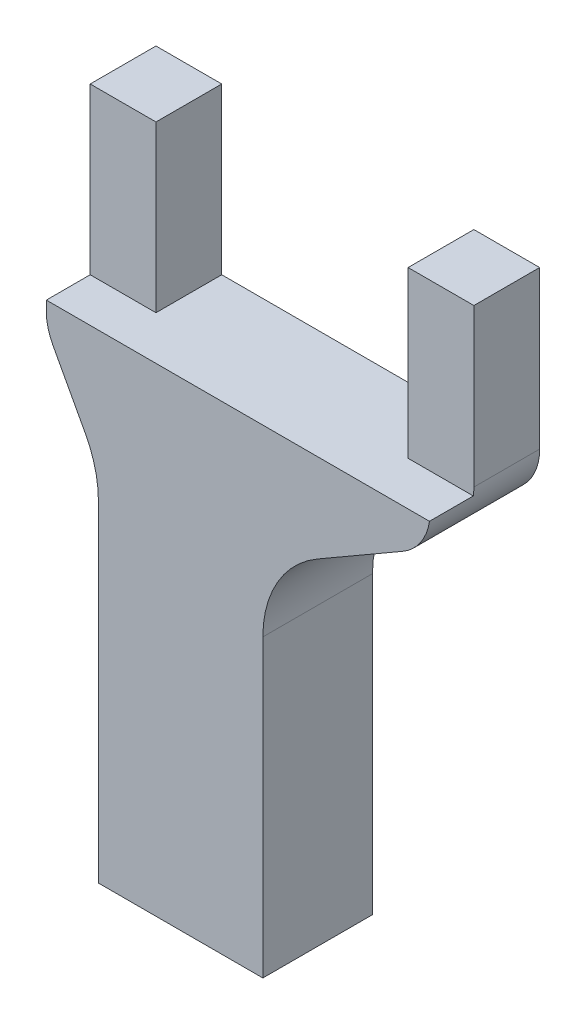
ISO-10303-21;
HEADER;
FILE_DESCRIPTION(('STEP AP214'),'2;1');
FILE_NAME('part.step','',(''),(''),'','','');
FILE_SCHEMA(('AUTOMOTIVE_DESIGN { 1 0 10303 214 1 1 1 1 }'));
ENDSEC;
DATA;
#1=APPLICATION_CONTEXT('core data for automotive mechanical design processes');
#2=APPLICATION_PROTOCOL_DEFINITION('international standard','automotive_design',2000,#1);
#3=PRODUCT_CONTEXT('',#1,'mechanical');
#4=PRODUCT('Part','Part','',(#3));
#5=PRODUCT_RELATED_PRODUCT_CATEGORY('part','',(#4));
#6=PRODUCT_DEFINITION_FORMATION('','',#4);
#7=PRODUCT_DEFINITION_CONTEXT('part definition',#1,'design');
#8=PRODUCT_DEFINITION('design','',#6,#7);
#9=PRODUCT_DEFINITION_SHAPE('','',#8);
#10=(LENGTH_UNIT() NAMED_UNIT(*) SI_UNIT(.MILLI.,.METRE.));
#11=(NAMED_UNIT(*) PLANE_ANGLE_UNIT() SI_UNIT($,.RADIAN.));
#12=(NAMED_UNIT(*) SI_UNIT($,.STERADIAN.) SOLID_ANGLE_UNIT());
#13=UNCERTAINTY_MEASURE_WITH_UNIT(LENGTH_MEASURE(1.E-05),#10,'distance_accuracy_value','');
#14=(GEOMETRIC_REPRESENTATION_CONTEXT(3) GLOBAL_UNCERTAINTY_ASSIGNED_CONTEXT((#13)) GLOBAL_UNIT_ASSIGNED_CONTEXT((#10,
#11,#12)) REPRESENTATION_CONTEXT('',''));
#15=CARTESIAN_POINT('',(0.,0.,0.));
#16=DIRECTION('',(0.,0.,1.));
#17=DIRECTION('',(1.,0.,0.));
#18=AXIS2_PLACEMENT_3D('',#15,#16,#17);
#19=CARTESIAN_POINT('',(-6.24999999999976,526.071170630325,10.));
#20=DIRECTION('',(0.,-1.,0.));
#21=DIRECTION('',(0.,0.,-1.));
#22=AXIS2_PLACEMENT_3D('',#19,#20,#21);
#23=PLANE('',#22);
#24=DIRECTION('',(-1.,0.,0.));
#25=VECTOR('',#24,1.);
#26=CARTESIAN_POINT('',(-12.2499999999998,526.071170630325,6.));
#27=LINE('',#26,#25);
#28=CARTESIAN_POINT('',(-6.24999999999976,526.071170630325,6.));
#29=VERTEX_POINT('',#28);
#30=CARTESIAN_POINT('',(-12.2499999999998,526.071170630325,6.));
#31=VERTEX_POINT('',#30);
#32=EDGE_CURVE('E174',#29,#31,#27,.T.);
#33=ORIENTED_EDGE('',*,*,#32,.F.);
#34=DIRECTION('',(0.,0.,-1.));
#35=VECTOR('',#34,1.);
#36=CARTESIAN_POINT('',(-6.24999999999976,526.071170630325,10.));
#37=LINE('',#36,#35);
#38=CARTESIAN_POINT('',(-6.24999999999976,526.071170630325,0.));
#39=VERTEX_POINT('',#38);
#40=EDGE_CURVE('E206',#29,#39,#37,.T.);
#41=ORIENTED_EDGE('',*,*,#40,.T.);
#42=DIRECTION('',(-1.,0.,0.));
#43=VECTOR('',#42,1.);
#44=CARTESIAN_POINT('',(-6.24999999999976,526.071170630325,0.));
#45=LINE('',#44,#43);
#46=CARTESIAN_POINT('',(-12.2499999999998,526.071170630325,0.));
#47=VERTEX_POINT('',#46);
#48=EDGE_CURVE('E190',#39,#47,#45,.T.);
#49=ORIENTED_EDGE('',*,*,#48,.T.);
#50=DIRECTION('',(0.,0.,-1.));
#51=VECTOR('',#50,1.);
#52=CARTESIAN_POINT('',(-12.2499999999998,526.071170630325,10.));
#53=LINE('',#52,#51);
#54=EDGE_CURVE('E251',#31,#47,#53,.T.);
#55=ORIENTED_EDGE('',*,*,#54,.F.);
#56=EDGE_LOOP('',(#33,#41,#49,#55));
#57=FACE_BOUND('',#56,.T.);
#58=ADVANCED_FACE('F35',(#57),#23,.F.);
#59=CARTESIAN_POINT('',(22.7500000000002,526.071170630325,10.));
#60=DIRECTION('',(-1.,0.,0.));
#61=DIRECTION('',(0.,-1.,0.));
#62=AXIS2_PLACEMENT_3D('',#59,#60,#61);
#63=PLANE('',#62);
#64=DIRECTION('',(0.,1.,0.));
#65=VECTOR('',#64,1.);
#66=CARTESIAN_POINT('',(22.7500000000002,526.071170630325,6.));
#67=LINE('',#66,#65);
#68=CARTESIAN_POINT('',(22.7500000000003,511.729317394923,6.));
#69=VERTEX_POINT('',#68);
#70=CARTESIAN_POINT('',(22.7500000000002,526.071170630325,6.));
#71=VERTEX_POINT('',#70);
#72=EDGE_CURVE('E168',#69,#71,#67,.T.);
#73=ORIENTED_EDGE('',*,*,#72,.F.);
#74=DIRECTION('',(0.,0.,-1.));
#75=VECTOR('',#74,1.);
#76=CARTESIAN_POINT('',(22.7500000000003,511.729317394923,10.));
#77=LINE('',#76,#75);
#78=CARTESIAN_POINT('',(22.7500000000003,511.729317394923,0.));
#79=VERTEX_POINT('',#78);
#80=EDGE_CURVE('E286',#69,#79,#77,.T.);
#81=ORIENTED_EDGE('',*,*,#80,.T.);
#82=DIRECTION('',(0.,1.,0.));
#83=VECTOR('',#82,1.);
#84=CARTESIAN_POINT('',(22.7500000000002,526.071170630325,0.));
#85=LINE('',#84,#83);
#86=CARTESIAN_POINT('',(22.7500000000002,526.071170630325,0.));
#87=VERTEX_POINT('',#86);
#88=EDGE_CURVE('E224',#79,#87,#85,.T.);
#89=ORIENTED_EDGE('',*,*,#88,.T.);
#90=DIRECTION('',(0.,0.,-1.));
#91=VECTOR('',#90,1.);
#92=CARTESIAN_POINT('',(22.7500000000002,526.071170630325,10.));
#93=LINE('',#92,#91);
#94=EDGE_CURVE('E243',#71,#87,#93,.T.);
#95=ORIENTED_EDGE('',*,*,#94,.F.);
#96=EDGE_LOOP('',(#73,#81,#89,#95));
#97=FACE_BOUND('',#96,.T.);
#98=ADVANCED_FACE('F300',(#97),#63,.F.);
#99=CARTESIAN_POINT('',(16.7500000000002,526.071170630325,10.));
#100=DIRECTION('',(0.,-1.,0.));
#101=DIRECTION('',(0.,0.,-1.));
#102=AXIS2_PLACEMENT_3D('',#99,#100,#101);
#103=PLANE('',#102);
#104=CARTESIAN_POINT('',(16.7500000000003,526.071170630325,6.));
#105=VERTEX_POINT('',#104);
#106=EDGE_CURVE('E182',#71,#105,#27,.T.);
#107=ORIENTED_EDGE('',*,*,#106,.F.);
#108=ORIENTED_EDGE('',*,*,#94,.T.);
#109=DIRECTION('',(-1.,0.,0.));
#110=VECTOR('',#109,1.);
#111=CARTESIAN_POINT('',(16.7500000000002,526.071170630325,0.));
#112=LINE('',#111,#110);
#113=CARTESIAN_POINT('',(16.7500000000002,526.071170630325,0.));
#114=VERTEX_POINT('',#113);
#115=EDGE_CURVE('E227',#87,#114,#112,.T.);
#116=ORIENTED_EDGE('',*,*,#115,.T.);
#117=DIRECTION('',(0.,0.,-1.));
#118=VECTOR('',#117,1.);
#119=CARTESIAN_POINT('',(16.7500000000002,526.071170630325,10.));
#120=LINE('',#119,#118);
#121=EDGE_CURVE('E241',#105,#114,#120,.T.);
#122=ORIENTED_EDGE('',*,*,#121,.F.);
#123=EDGE_LOOP('',(#107,#108,#116,#122));
#124=FACE_BOUND('',#123,.T.);
#125=ADVANCED_FACE('F304',(#124),#103,.F.);
#126=CARTESIAN_POINT('',(16.7500000000002,526.071170630325,10.));
#127=DIRECTION('',(1.,0.,0.));
#128=DIRECTION('',(0.,1.,0.));
#129=AXIS2_PLACEMENT_3D('',#126,#127,#128);
#130=PLANE('',#129);
#131=DIRECTION('',(0.,-1.,0.));
#132=VECTOR('',#131,1.);
#133=CARTESIAN_POINT('',(16.7500000000002,526.071170630325,6.));
#134=LINE('',#133,#132);
#135=CARTESIAN_POINT('',(16.7500000000003,511.000207075114,6.));
#136=VERTEX_POINT('',#135);
#137=EDGE_CURVE('E184',#105,#136,#134,.T.);
#138=ORIENTED_EDGE('',*,*,#137,.F.);
#139=ORIENTED_EDGE('',*,*,#121,.T.);
#140=DIRECTION('',(0.,-1.,0.));
#141=VECTOR('',#140,1.);
#142=CARTESIAN_POINT('',(16.7500000000002,526.071170630325,0.));
#143=LINE('',#142,#141);
#144=CARTESIAN_POINT('',(16.7500000000003,511.000207075114,0.));
#145=VERTEX_POINT('',#144);
#146=EDGE_CURVE('E230',#114,#145,#143,.T.);
#147=ORIENTED_EDGE('',*,*,#146,.T.);
#148=DIRECTION('',(0.,0.,-1.));
#149=VECTOR('',#148,1.);
#150=CARTESIAN_POINT('',(16.7500000000003,511.000207075114,10.));
#151=LINE('',#150,#149);
#152=EDGE_CURVE('E239',#136,#145,#151,.T.);
#153=ORIENTED_EDGE('',*,*,#152,.F.);
#154=EDGE_LOOP('',(#138,#139,#147,#153));
#155=FACE_BOUND('',#154,.T.);
#156=ADVANCED_FACE('F310',(#155),#130,.F.);
#157=CARTESIAN_POINT('',(-6.24999999999976,526.071170630325,10.));
#158=DIRECTION('',(-1.,0.,0.));
#159=DIRECTION('',(0.,-1.,0.));
#160=AXIS2_PLACEMENT_3D('',#157,#158,#159);
#161=PLANE('',#160);
#162=DIRECTION('',(0.,1.,0.));
#163=VECTOR('',#162,1.);
#164=CARTESIAN_POINT('',(-6.24999999999976,526.071170630325,6.));
#165=LINE('',#164,#163);
#166=CARTESIAN_POINT('',(-6.24999999999976,511.000207075114,6.));
#167=VERTEX_POINT('',#166);
#168=EDGE_CURVE('E181',#167,#29,#165,.T.);
#169=ORIENTED_EDGE('',*,*,#168,.F.);
#170=DIRECTION('',(0.,0.,-1.));
#171=VECTOR('',#170,1.);
#172=CARTESIAN_POINT('',(-6.24999999999976,511.000207075114,10.));
#173=LINE('',#172,#171);
#174=CARTESIAN_POINT('',(-6.24999999999976,511.000207075114,0.));
#175=VERTEX_POINT('',#174);
#176=EDGE_CURVE('E165',#167,#175,#173,.T.);
#177=ORIENTED_EDGE('',*,*,#176,.T.);
#178=DIRECTION('',(0.,1.,0.));
#179=VECTOR('',#178,1.);
#180=CARTESIAN_POINT('',(-6.24999999999976,526.071170630325,0.));
#181=LINE('',#180,#179);
#182=EDGE_CURVE('E193',#175,#39,#181,.T.);
#183=ORIENTED_EDGE('',*,*,#182,.T.);
#184=ORIENTED_EDGE('',*,*,#40,.F.);
#185=EDGE_LOOP('',(#169,#177,#183,#184));
#186=FACE_BOUND('',#185,.T.);
#187=ADVANCED_FACE('F320',(#186),#161,.F.);
#188=CARTESIAN_POINT('',(-12.2499999999998,526.071170630325,10.));
#189=DIRECTION('',(1.,0.,0.));
#190=DIRECTION('',(0.,1.,0.));
#191=AXIS2_PLACEMENT_3D('',#188,#189,#190);
#192=PLANE('',#191);
#193=DIRECTION('',(0.,-1.,0.));
#194=VECTOR('',#193,1.);
#195=CARTESIAN_POINT('',(-12.2499999999998,526.071170630325,10.));
#196=LINE('',#195,#194);
#197=CARTESIAN_POINT('',(-12.2499999999998,511.000207075114,10.));
#198=VERTEX_POINT('',#197);
#199=CARTESIAN_POINT('',(-12.2499999999998,510.105275726691,10.));
#200=VERTEX_POINT('',#199);
#201=EDGE_CURVE('E180',#198,#200,#196,.T.);
#202=ORIENTED_EDGE('',*,*,#201,.F.);
#203=DIRECTION('',(0.,0.,1.));
#204=VECTOR('',#203,1.);
#205=CARTESIAN_POINT('',(-12.2499999999998,511.000207075114,6.));
#206=LINE('',#205,#204);
#207=CARTESIAN_POINT('',(-12.2499999999998,511.000207075114,6.));
#208=VERTEX_POINT('',#207);
#209=EDGE_CURVE('E162',#208,#198,#206,.T.);
#210=ORIENTED_EDGE('',*,*,#209,.F.);
#211=DIRECTION('',(0.,-1.,0.));
#212=VECTOR('',#211,1.);
#213=CARTESIAN_POINT('',(-12.2499999999998,526.071170630325,6.));
#214=LINE('',#213,#212);
#215=EDGE_CURVE('E171',#31,#208,#214,.T.);
#216=ORIENTED_EDGE('',*,*,#215,.F.);
#217=ORIENTED_EDGE('',*,*,#54,.T.);
#218=DIRECTION('',(0.,-1.,0.));
#219=VECTOR('',#218,1.);
#220=CARTESIAN_POINT('',(-12.2499999999998,526.071170630325,0.));
#221=LINE('',#220,#219);
#222=CARTESIAN_POINT('',(-12.2499999999998,510.105275726691,0.));
#223=VERTEX_POINT('',#222);
#224=EDGE_CURVE('E209',#47,#223,#221,.T.);
#225=ORIENTED_EDGE('',*,*,#224,.T.);
#226=DIRECTION('',(0.,0.,-1.));
#227=VECTOR('',#226,1.);
#228=CARTESIAN_POINT('',(-12.2499999999998,510.105275726691,10.));
#229=LINE('',#228,#227);
#230=EDGE_CURVE('E280',#223,#200,#229,.F.);
#231=ORIENTED_EDGE('',*,*,#230,.T.);
#232=EDGE_LOOP('',(#202,#210,#216,#217,#225,#231));
#233=FACE_BOUND('',#232,.T.);
#234=ADVANCED_FACE('F178',(#233),#192,.F.);
#235=CARTESIAN_POINT('',(-12.2499999999998,508.842566048975,10.));
#236=DIRECTION('',(0.880092531657774,0.474802206945388,0.));
#237=DIRECTION('',(-0.474802206945388,0.880092531657774,0.));
#238=AXIS2_PLACEMENT_3D('',#235,#236,#237);
#239=PLANE('',#238);
#240=DIRECTION('',(0.474802206945388,-0.880092531657774,0.));
#241=VECTOR('',#240,1.);
#242=CARTESIAN_POINT('',(-12.2499999999998,508.842566048975,10.));
#243=LINE('',#242,#241);
#244=CARTESIAN_POINT('',(-11.6504626582886,507.731264691964,10.));
#245=VERTEX_POINT('',#244);
#246=CARTESIAN_POINT('',(-8.69907468342228,502.260577157854,10.));
#247=VERTEX_POINT('',#246);
#248=EDGE_CURVE('E192',#245,#247,#243,.T.);
#249=ORIENTED_EDGE('',*,*,#248,.F.);
#250=DIRECTION('',(0.,0.,-1.));
#251=VECTOR('',#250,1.);
#252=CARTESIAN_POINT('',(-11.6504626582886,507.731264691964,10.));
#253=LINE('',#252,#251);
#254=CARTESIAN_POINT('',(-11.6504626582886,507.731264691964,0.));
#255=VERTEX_POINT('',#254);
#256=EDGE_CURVE('E273',#245,#255,#253,.T.);
#257=ORIENTED_EDGE('',*,*,#256,.T.);
#258=DIRECTION('',(0.474802206945388,-0.880092531657774,0.));
#259=VECTOR('',#258,1.);
#260=CARTESIAN_POINT('',(-12.2499999999998,508.842566048975,0.));
#261=LINE('',#260,#259);
#262=CARTESIAN_POINT('',(-8.69907468342228,502.260577157854,0.));
#263=VERTEX_POINT('',#262);
#264=EDGE_CURVE('E212',#255,#263,#261,.T.);
#265=ORIENTED_EDGE('',*,*,#264,.T.);
#266=DIRECTION('',(0.,0.,-1.));
#267=VECTOR('',#266,1.);
#268=CARTESIAN_POINT('',(-8.69907468342227,502.260577157854,10.));
#269=LINE('',#268,#267);
#270=EDGE_CURVE('E256',#263,#247,#269,.F.);
#271=ORIENTED_EDGE('',*,*,#270,.T.);
#272=EDGE_LOOP('',(#249,#257,#265,#271));
#273=FACE_BOUND('',#272,.T.);
#274=ADVANCED_FACE('F329',(#273),#239,.F.);
#275=CARTESIAN_POINT('',(-7.5,467.320715150803,10.));
#276=DIRECTION('',(1.,0.,0.));
#277=DIRECTION('',(0.,0.,-1.));
#278=AXIS2_PLACEMENT_3D('',#275,#276,#277);
#279=PLANE('',#278);
#280=DIRECTION('',(0.,-1.,0.));
#281=VECTOR('',#280,1.);
#282=CARTESIAN_POINT('',(-7.5,467.320715150803,10.));
#283=LINE('',#282,#281);
#284=CARTESIAN_POINT('',(-7.5,497.5125550884,10.));
#285=VERTEX_POINT('',#284);
#286=CARTESIAN_POINT('',(-7.5,467.320715150803,10.));
#287=VERTEX_POINT('',#286);
#288=EDGE_CURVE('E195',#285,#287,#283,.T.);
#289=ORIENTED_EDGE('',*,*,#288,.F.);
#290=DIRECTION('',(0.,0.,-1.));
#291=VECTOR('',#290,1.);
#292=CARTESIAN_POINT('',(-7.5,497.5125550884,0.));
#293=LINE('',#292,#291);
#294=CARTESIAN_POINT('',(-7.5,497.5125550884,0.));
#295=VERTEX_POINT('',#294);
#296=EDGE_CURVE('E253',#285,#295,#293,.T.);
#297=ORIENTED_EDGE('',*,*,#296,.T.);
#298=DIRECTION('',(0.,-1.,0.));
#299=VECTOR('',#298,1.);
#300=CARTESIAN_POINT('',(-7.5,467.320715150803,0.));
#301=LINE('',#300,#299);
#302=CARTESIAN_POINT('',(-7.5,467.320715150803,0.));
#303=VERTEX_POINT('',#302);
#304=EDGE_CURVE('E214',#295,#303,#301,.T.);
#305=ORIENTED_EDGE('',*,*,#304,.T.);
#306=DIRECTION('',(0.,0.,-1.));
#307=VECTOR('',#306,1.);
#308=CARTESIAN_POINT('',(-7.5,467.320715150803,10.));
#309=LINE('',#308,#307);
#310=EDGE_CURVE('E248',#287,#303,#309,.T.);
#311=ORIENTED_EDGE('',*,*,#310,.F.);
#312=EDGE_LOOP('',(#289,#297,#305,#311));
#313=FACE_BOUND('',#312,.T.);
#314=ADVANCED_FACE('F338',(#313),#279,.F.);
#315=CARTESIAN_POINT('',(7.5,467.320715150803,10.));
#316=DIRECTION('',(0.,1.,0.));
#317=DIRECTION('',(0.,0.,1.));
#318=AXIS2_PLACEMENT_3D('',#315,#316,#317);
#319=PLANE('',#318);
#320=DIRECTION('',(1.,0.,0.));
#321=VECTOR('',#320,1.);
#322=CARTESIAN_POINT('',(7.5,467.320715150803,0.));
#323=LINE('',#322,#321);
#324=CARTESIAN_POINT('',(7.5,467.320715150803,0.));
#325=VERTEX_POINT('',#324);
#326=EDGE_CURVE('E216',#303,#325,#323,.T.);
#327=ORIENTED_EDGE('',*,*,#326,.T.);
#328=DIRECTION('',(0.,0.,-1.));
#329=VECTOR('',#328,1.);
#330=CARTESIAN_POINT('',(7.5,467.320715150803,10.));
#331=LINE('',#330,#329);
#332=CARTESIAN_POINT('',(7.5,467.320715150803,10.));
#333=VERTEX_POINT('',#332);
#334=EDGE_CURVE('E245',#333,#325,#331,.T.);
#335=ORIENTED_EDGE('',*,*,#334,.F.);
#336=DIRECTION('',(1.,0.,0.));
#337=VECTOR('',#336,1.);
#338=CARTESIAN_POINT('',(7.5,467.320715150803,10.));
#339=LINE('',#338,#337);
#340=EDGE_CURVE('E197',#287,#333,#339,.T.);
#341=ORIENTED_EDGE('',*,*,#340,.F.);
#342=ORIENTED_EDGE('',*,*,#310,.T.);
#343=EDGE_LOOP('',(#327,#335,#341,#342));
#344=FACE_BOUND('',#343,.T.);
#345=ADVANCED_FACE('F345',(#344),#319,.F.);
#346=CARTESIAN_POINT('',(7.5,467.320715150803,10.));
#347=DIRECTION('',(-1.,0.,0.));
#348=DIRECTION('',(0.,0.,1.));
#349=AXIS2_PLACEMENT_3D('',#346,#347,#348);
#350=PLANE('',#349);
#351=DIRECTION('',(0.,1.,0.));
#352=VECTOR('',#351,1.);
#353=CARTESIAN_POINT('',(7.5,467.320715150803,0.));
#354=LINE('',#353,#352);
#355=CARTESIAN_POINT('',(7.5,494.264471751936,0.));
#356=VERTEX_POINT('',#355);
#357=EDGE_CURVE('E218',#325,#356,#354,.T.);
#358=ORIENTED_EDGE('',*,*,#357,.T.);
#359=DIRECTION('',(0.,0.,-1.));
#360=VECTOR('',#359,1.);
#361=CARTESIAN_POINT('',(7.5,494.264471751936,10.));
#362=LINE('',#361,#360);
#363=CARTESIAN_POINT('',(7.5,494.264471751936,10.));
#364=VERTEX_POINT('',#363);
#365=EDGE_CURVE('E262',#356,#364,#362,.F.);
#366=ORIENTED_EDGE('',*,*,#365,.T.);
#367=DIRECTION('',(0.,1.,0.));
#368=VECTOR('',#367,1.);
#369=CARTESIAN_POINT('',(7.5,467.320715150803,10.));
#370=LINE('',#369,#368);
#371=EDGE_CURVE('E199',#333,#364,#370,.T.);
#372=ORIENTED_EDGE('',*,*,#371,.F.);
#373=ORIENTED_EDGE('',*,*,#334,.T.);
#374=EDGE_LOOP('',(#358,#366,#372,#373));
#375=FACE_BOUND('',#374,.T.);
#376=ADVANCED_FACE('F359',(#375),#350,.F.);
#377=CARTESIAN_POINT('',(22.7500000000003,508.842566048975,10.));
#378=DIRECTION('',(-0.499999999999999,0.866025403784439,0.));
#379=DIRECTION('',(-0.866025403784439,-0.499999999999999,0.));
#380=AXIS2_PLACEMENT_3D('',#377,#378,#379);
#381=PLANE('',#380);
#382=DIRECTION('',(0.866025403784439,0.499999999999999,0.));
#383=VECTOR('',#382,1.);
#384=CARTESIAN_POINT('',(22.7500000000003,508.842566048975,0.));
#385=LINE('',#384,#383);
#386=CARTESIAN_POINT('',(12.5,502.924725789781,0.));
#387=VERTEX_POINT('',#386);
#388=CARTESIAN_POINT('',(20.2500000000003,507.399190376001,0.));
#389=VERTEX_POINT('',#388);
#390=EDGE_CURVE('E221',#387,#389,#385,.T.);
#391=ORIENTED_EDGE('',*,*,#390,.T.);
#392=DIRECTION('',(0.,0.,-1.));
#393=VECTOR('',#392,1.);
#394=CARTESIAN_POINT('',(20.2500000000003,507.399190376001,10.));
#395=LINE('',#394,#393);
#396=CARTESIAN_POINT('',(20.2500000000003,507.399190376001,10.));
#397=VERTEX_POINT('',#396);
#398=EDGE_CURVE('E288',#389,#397,#395,.F.);
#399=ORIENTED_EDGE('',*,*,#398,.T.);
#400=DIRECTION('',(0.866025403784439,0.499999999999999,0.));
#401=VECTOR('',#400,1.);
#402=CARTESIAN_POINT('',(22.7500000000003,508.842566048975,10.));
#403=LINE('',#402,#401);
#404=CARTESIAN_POINT('',(12.5,502.924725789781,10.));
#405=VERTEX_POINT('',#404);
#406=EDGE_CURVE('E202',#405,#397,#403,.T.);
#407=ORIENTED_EDGE('',*,*,#406,.F.);
#408=DIRECTION('',(0.,0.,-1.));
#409=VECTOR('',#408,1.);
#410=CARTESIAN_POINT('',(12.5,502.924725789781,0.));
#411=LINE('',#410,#409);
#412=EDGE_CURVE('E259',#405,#387,#411,.T.);
#413=ORIENTED_EDGE('',*,*,#412,.T.);
#414=EDGE_LOOP('',(#391,#399,#407,#413));
#415=FACE_BOUND('',#414,.T.);
#416=ADVANCED_FACE('F357',(#415),#381,.F.);
#417=CARTESIAN_POINT('',(-6.24999999999976,511.000207075114,10.));
#418=DIRECTION('',(0.,-1.,0.));
#419=DIRECTION('',(0.,0.,-1.));
#420=AXIS2_PLACEMENT_3D('',#417,#418,#419);
#421=PLANE('',#420);
#422=DIRECTION('',(-1.,0.,0.));
#423=VECTOR('',#422,1.);
#424=CARTESIAN_POINT('',(-6.24999999999976,511.000207075114,10.));
#425=LINE('',#424,#423);
#426=CARTESIAN_POINT('',(22.6965541684642,511.000207075114,10.));
#427=VERTEX_POINT('',#426);
#428=EDGE_CURVE('E50',#427,#198,#425,.T.);
#429=ORIENTED_EDGE('',*,*,#428,.F.);
#430=DIRECTION('',(0.,0.,-1.));
#431=VECTOR('',#430,1.);
#432=CARTESIAN_POINT('',(22.6965541684642,511.000207075114,10.));
#433=LINE('',#432,#431);
#434=CARTESIAN_POINT('',(22.6965541684642,511.000207075114,6.));
#435=VERTEX_POINT('',#434);
#436=EDGE_CURVE('E11',#427,#435,#433,.T.);
#437=ORIENTED_EDGE('',*,*,#436,.T.);
#438=DIRECTION('',(1.,0.,0.));
#439=VECTOR('',#438,1.);
#440=CARTESIAN_POINT('',(-12.2499999999998,511.000207075114,6.));
#441=LINE('',#440,#439);
#442=EDGE_CURVE('E58',#136,#435,#441,.T.);
#443=ORIENTED_EDGE('',*,*,#442,.F.);
#444=ORIENTED_EDGE('',*,*,#152,.T.);
#445=DIRECTION('',(-1.,0.,0.));
#446=VECTOR('',#445,1.);
#447=CARTESIAN_POINT('',(-6.24999999999976,511.000207075114,0.));
#448=LINE('',#447,#446);
#449=EDGE_CURVE('E233',#145,#175,#448,.T.);
#450=ORIENTED_EDGE('',*,*,#449,.T.);
#451=ORIENTED_EDGE('',*,*,#176,.F.);
#452=EDGE_CURVE('E158',#208,#167,#441,.T.);
#453=ORIENTED_EDGE('',*,*,#452,.F.);
#454=ORIENTED_EDGE('',*,*,#209,.T.);
#455=EDGE_LOOP('',(#429,#437,#443,#444,#450,#451,#453,#454));
#456=FACE_BOUND('',#455,.T.);
#457=ADVANCED_FACE('F160',(#456),#421,.F.);
#458=CARTESIAN_POINT('',(0.,0.,10.));
#459=DIRECTION('',(0.,0.,1.));
#460=DIRECTION('',(1.,0.,0.));
#461=AXIS2_PLACEMENT_3D('',#458,#459,#460);
#462=PLANE('',#461);
#463=ORIENTED_EDGE('',*,*,#428,.T.);
#464=ORIENTED_EDGE('',*,*,#201,.T.);
#465=CARTESIAN_POINT('',(-7.24999999999976,510.105275726691,10.));
#466=DIRECTION('',(0.,0.,1.));
#467=DIRECTION('',(1.,0.,0.));
#468=AXIS2_PLACEMENT_3D('',#465,#466,#467);
#469=CIRCLE('',#468,5.);
#470=EDGE_CURVE('E284',#200,#245,#469,.T.);
#471=ORIENTED_EDGE('',*,*,#470,.T.);
#472=ORIENTED_EDGE('',*,*,#248,.T.);
#473=CARTESIAN_POINT('',(-17.5,497.5125550884,10.));
#474=DIRECTION('',(0.,0.,1.));
#475=DIRECTION('',(1.,0.,0.));
#476=AXIS2_PLACEMENT_3D('',#473,#474,#475);
#477=CIRCLE('',#476,10.);
#478=EDGE_CURVE('E267',#247,#285,#477,.F.);
#479=ORIENTED_EDGE('',*,*,#478,.T.);
#480=ORIENTED_EDGE('',*,*,#288,.T.);
#481=ORIENTED_EDGE('',*,*,#340,.T.);
#482=ORIENTED_EDGE('',*,*,#371,.T.);
#483=CARTESIAN_POINT('',(17.5,494.264471751936,10.));
#484=DIRECTION('',(0.,0.,1.));
#485=DIRECTION('',(1.,0.,0.));
#486=AXIS2_PLACEMENT_3D('',#483,#484,#485);
#487=CIRCLE('',#486,10.);
#488=EDGE_CURVE('E271',#364,#405,#487,.F.);
#489=ORIENTED_EDGE('',*,*,#488,.T.);
#490=ORIENTED_EDGE('',*,*,#406,.T.);
#491=CARTESIAN_POINT('',(17.7500000000003,511.729317394923,10.));
#492=DIRECTION('',(0.,0.,1.));
#493=DIRECTION('',(1.,0.,0.));
#494=AXIS2_PLACEMENT_3D('',#491,#492,#493);
#495=CIRCLE('',#494,5.);
#496=EDGE_CURVE('E282',#397,#427,#495,.T.);
#497=ORIENTED_EDGE('',*,*,#496,.T.);
#498=EDGE_LOOP('',(#463,#464,#471,#472,#479,#480,#481,#482,#489,#490,#497));
#499=FACE_BOUND('',#498,.T.);
#500=ADVANCED_FACE('F332',(#499),#462,.T.);
#501=CARTESIAN_POINT('',(0.,0.,0.));
#502=DIRECTION('',(0.,0.,1.));
#503=DIRECTION('',(1.,0.,0.));
#504=AXIS2_PLACEMENT_3D('',#501,#502,#503);
#505=PLANE('',#504);
#506=ORIENTED_EDGE('',*,*,#264,.F.);
#507=CARTESIAN_POINT('',(-7.24999999999976,510.105275726691,0.));
#508=DIRECTION('',(0.,0.,1.));
#509=DIRECTION('',(1.,0.,0.));
#510=AXIS2_PLACEMENT_3D('',#507,#508,#509);
#511=CIRCLE('',#510,5.);
#512=EDGE_CURVE('E278',#255,#223,#511,.F.);
#513=ORIENTED_EDGE('',*,*,#512,.T.);
#514=ORIENTED_EDGE('',*,*,#224,.F.);
#515=ORIENTED_EDGE('',*,*,#48,.F.);
#516=ORIENTED_EDGE('',*,*,#182,.F.);
#517=ORIENTED_EDGE('',*,*,#449,.F.);
#518=ORIENTED_EDGE('',*,*,#146,.F.);
#519=ORIENTED_EDGE('',*,*,#115,.F.);
#520=ORIENTED_EDGE('',*,*,#88,.F.);
#521=CARTESIAN_POINT('',(17.7500000000003,511.729317394923,0.));
#522=DIRECTION('',(0.,0.,1.));
#523=DIRECTION('',(1.,0.,0.));
#524=AXIS2_PLACEMENT_3D('',#521,#522,#523);
#525=CIRCLE('',#524,5.);
#526=EDGE_CURVE('E276',#79,#389,#525,.F.);
#527=ORIENTED_EDGE('',*,*,#526,.T.);
#528=ORIENTED_EDGE('',*,*,#390,.F.);
#529=CARTESIAN_POINT('',(17.5,494.264471751936,0.));
#530=DIRECTION('',(0.,0.,1.));
#531=DIRECTION('',(1.,0.,0.));
#532=AXIS2_PLACEMENT_3D('',#529,#530,#531);
#533=CIRCLE('',#532,10.);
#534=EDGE_CURVE('E269',#387,#356,#533,.T.);
#535=ORIENTED_EDGE('',*,*,#534,.T.);
#536=ORIENTED_EDGE('',*,*,#357,.F.);
#537=ORIENTED_EDGE('',*,*,#326,.F.);
#538=ORIENTED_EDGE('',*,*,#304,.F.);
#539=CARTESIAN_POINT('',(-17.5,497.5125550884,0.));
#540=DIRECTION('',(0.,0.,1.));
#541=DIRECTION('',(1.,0.,0.));
#542=AXIS2_PLACEMENT_3D('',#539,#540,#541);
#543=CIRCLE('',#542,10.);
#544=EDGE_CURVE('E264',#295,#263,#543,.T.);
#545=ORIENTED_EDGE('',*,*,#544,.T.);
#546=EDGE_LOOP('',(#506,#513,#514,#515,#516,#517,#518,#519,#520,#527,#528,#535,#536,#537,#538,#545));
#547=FACE_BOUND('',#546,.T.);
#548=ADVANCED_FACE('F316',(#547),#505,.F.);
#549=CARTESIAN_POINT('',(-17.5,497.5125550884,10.));
#550=DIRECTION('',(0.,0.,1.));
#551=DIRECTION('',(1.,0.,0.));
#552=AXIS2_PLACEMENT_3D('',#549,#550,#551);
#553=CYLINDRICAL_SURFACE('',#552,10.);
#554=ORIENTED_EDGE('',*,*,#478,.F.);
#555=ORIENTED_EDGE('',*,*,#270,.F.);
#556=ORIENTED_EDGE('',*,*,#544,.F.);
#557=ORIENTED_EDGE('',*,*,#296,.F.);
#558=EDGE_LOOP('',(#554,#555,#556,#557));
#559=FACE_BOUND('',#558,.T.);
#560=ADVANCED_FACE('F341',(#559),#553,.F.);
#561=CARTESIAN_POINT('',(17.5,494.264471751936,10.));
#562=DIRECTION('',(0.,0.,1.));
#563=DIRECTION('',(1.,0.,0.));
#564=AXIS2_PLACEMENT_3D('',#561,#562,#563);
#565=CYLINDRICAL_SURFACE('',#564,10.);
#566=ORIENTED_EDGE('',*,*,#488,.F.);
#567=ORIENTED_EDGE('',*,*,#365,.F.);
#568=ORIENTED_EDGE('',*,*,#534,.F.);
#569=ORIENTED_EDGE('',*,*,#412,.F.);
#570=EDGE_LOOP('',(#566,#567,#568,#569));
#571=FACE_BOUND('',#570,.T.);
#572=ADVANCED_FACE('F354',(#571),#565,.F.);
#573=CARTESIAN_POINT('',(-7.24999999999976,510.105275726691,10.));
#574=DIRECTION('',(0.,0.,-1.));
#575=DIRECTION('',(-1.,0.,0.));
#576=AXIS2_PLACEMENT_3D('',#573,#574,#575);
#577=CYLINDRICAL_SURFACE('',#576,5.);
#578=ORIENTED_EDGE('',*,*,#470,.F.);
#579=ORIENTED_EDGE('',*,*,#230,.F.);
#580=ORIENTED_EDGE('',*,*,#512,.F.);
#581=ORIENTED_EDGE('',*,*,#256,.F.);
#582=EDGE_LOOP('',(#578,#579,#580,#581));
#583=FACE_BOUND('',#582,.T.);
#584=ADVANCED_FACE('F326',(#583),#577,.T.);
#585=CARTESIAN_POINT('',(17.7500000000003,511.729317394923,10.));
#586=DIRECTION('',(0.,0.,-1.));
#587=DIRECTION('',(-1.,0.,0.));
#588=AXIS2_PLACEMENT_3D('',#585,#586,#587);
#589=CYLINDRICAL_SURFACE('',#588,5.);
#590=ORIENTED_EDGE('',*,*,#436,.F.);
#591=ORIENTED_EDGE('',*,*,#496,.F.);
#592=ORIENTED_EDGE('',*,*,#398,.F.);
#593=ORIENTED_EDGE('',*,*,#526,.F.);
#594=ORIENTED_EDGE('',*,*,#80,.F.);
#595=CARTESIAN_POINT('',(17.7500000000003,511.729317394923,6.));
#596=DIRECTION('',(0.,0.,1.));
#597=DIRECTION('',(1.,0.,0.));
#598=AXIS2_PLACEMENT_3D('',#595,#596,#597);
#599=CIRCLE('',#598,5.);
#600=EDGE_CURVE('E43',#69,#435,#599,.F.);
#601=ORIENTED_EDGE('',*,*,#600,.T.);
#602=EDGE_LOOP('',(#590,#591,#592,#593,#594,#601));
#603=FACE_BOUND('',#602,.T.);
#604=ADVANCED_FACE('F37',(#603),#589,.T.);
#605=CARTESIAN_POINT('',(0.,0.,6.));
#606=DIRECTION('',(0.,0.,1.));
#607=DIRECTION('',(1.,0.,0.));
#608=AXIS2_PLACEMENT_3D('',#605,#606,#607);
#609=PLANE('',#608);
#610=ORIENTED_EDGE('',*,*,#137,.T.);
#611=ORIENTED_EDGE('',*,*,#442,.T.);
#612=ORIENTED_EDGE('',*,*,#600,.F.);
#613=ORIENTED_EDGE('',*,*,#72,.T.);
#614=ORIENTED_EDGE('',*,*,#106,.T.);
#615=EDGE_LOOP('',(#610,#611,#612,#613,#614));
#616=FACE_BOUND('',#615,.T.);
#617=ADVANCED_FACE('F296',(#616),#609,.T.);
#618=ORIENTED_EDGE('',*,*,#168,.T.);
#619=ORIENTED_EDGE('',*,*,#32,.T.);
#620=ORIENTED_EDGE('',*,*,#215,.T.);
#621=ORIENTED_EDGE('',*,*,#452,.T.);
#622=EDGE_LOOP('',(#618,#619,#620,#621));
#623=FACE_BOUND('',#622,.T.);
#624=ADVANCED_FACE('F172',(#623),#609,.T.);
#625=CLOSED_SHELL('',(#58,#98,#125,#156,#187,#234,#274,#314,#345,#376,#416,#457,#500,#548,#560,
#572,#584,#604,#617,#624));
#626=MANIFOLD_SOLID_BREP('B2',#625);
#627=ADVANCED_BREP_SHAPE_REPRESENTATION('',(#18,#626),#14);
#628=SHAPE_DEFINITION_REPRESENTATION(#9,#627);
ENDSEC;
END-ISO-10303-21;
